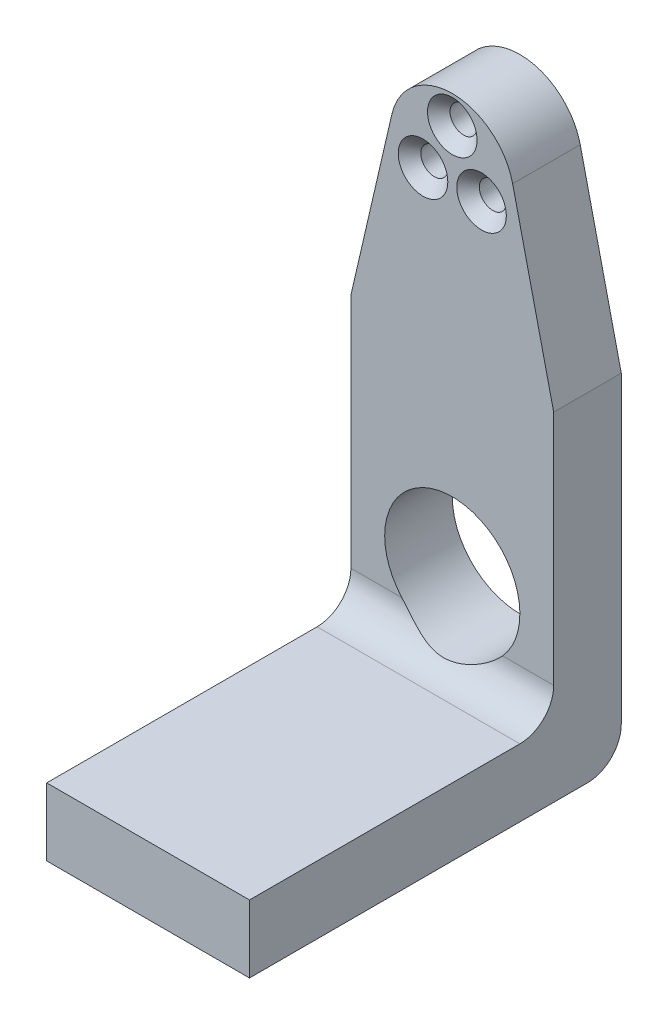
ISO-10303-21;
HEADER;
FILE_DESCRIPTION(('STEP AP214'),'2;1');
FILE_NAME('part.step','',(''),(''),'','','');
FILE_SCHEMA(('AUTOMOTIVE_DESIGN { 1 0 10303 214 1 1 1 1 }'));
ENDSEC;
DATA;
#1=APPLICATION_CONTEXT('core data for automotive mechanical design processes');
#2=APPLICATION_PROTOCOL_DEFINITION('international standard','automotive_design',2000,#1);
#3=PRODUCT_CONTEXT('',#1,'mechanical');
#4=PRODUCT('Part','Part','',(#3));
#5=PRODUCT_RELATED_PRODUCT_CATEGORY('part','',(#4));
#6=PRODUCT_DEFINITION_FORMATION('','',#4);
#7=PRODUCT_DEFINITION_CONTEXT('part definition',#1,'design');
#8=PRODUCT_DEFINITION('design','',#6,#7);
#9=PRODUCT_DEFINITION_SHAPE('','',#8);
#10=(LENGTH_UNIT() NAMED_UNIT(*) SI_UNIT(.MILLI.,.METRE.));
#11=(NAMED_UNIT(*) PLANE_ANGLE_UNIT() SI_UNIT($,.RADIAN.));
#12=(NAMED_UNIT(*) SI_UNIT($,.STERADIAN.) SOLID_ANGLE_UNIT());
#13=UNCERTAINTY_MEASURE_WITH_UNIT(LENGTH_MEASURE(1.E-05),#10,'distance_accuracy_value','');
#14=(GEOMETRIC_REPRESENTATION_CONTEXT(3) GLOBAL_UNCERTAINTY_ASSIGNED_CONTEXT((#13)) GLOBAL_UNIT_ASSIGNED_CONTEXT((#10,
#11,#12)) REPRESENTATION_CONTEXT('',''));
#15=CARTESIAN_POINT('',(0.,0.,0.));
#16=DIRECTION('',(0.,0.,1.));
#17=DIRECTION('',(1.,0.,0.));
#18=AXIS2_PLACEMENT_3D('',#15,#16,#17);
#19=CARTESIAN_POINT('',(0.,44.5,6.));
#20=DIRECTION('',(0.,0.,-1.));
#21=DIRECTION('',(-1.,0.,0.));
#22=AXIS2_PLACEMENT_3D('',#19,#20,#21);
#23=PLANE('',#22);
#24=CARTESIAN_POINT('',(2.59807621135334,43.,6.));
#25=DIRECTION('',(0.,0.,1.));
#26=DIRECTION('',(1.,0.,0.));
#27=AXIS2_PLACEMENT_3D('',#24,#25,#26);
#28=CIRCLE('',#27,2.2);
#29=CARTESIAN_POINT('',(4.79807621135334,43.,6.));
#30=VERTEX_POINT('',#29);
#31=EDGE_CURVE('E313',#30,#30,#28,.T.);
#32=ORIENTED_EDGE('',*,*,#31,.F.);
#33=EDGE_LOOP('',(#32));
#34=FACE_BOUND('',#33,.T.);
#35=CARTESIAN_POINT('',(-2.59807621135331,43.,6.));
#36=DIRECTION('',(0.,0.,1.));
#37=DIRECTION('',(1.,0.,0.));
#38=AXIS2_PLACEMENT_3D('',#35,#36,#37);
#39=CIRCLE('',#38,2.2);
#40=CARTESIAN_POINT('',(-0.398076211353314,43.,6.));
#41=VERTEX_POINT('',#40);
#42=EDGE_CURVE('E301',#41,#41,#39,.T.);
#43=ORIENTED_EDGE('',*,*,#42,.F.);
#44=EDGE_LOOP('',(#43));
#45=FACE_BOUND('',#44,.T.);
#46=CARTESIAN_POINT('',(0.,47.5,6.));
#47=DIRECTION('',(0.,0.,1.));
#48=DIRECTION('',(1.,0.,0.));
#49=AXIS2_PLACEMENT_3D('',#46,#47,#48);
#50=CIRCLE('',#49,2.2);
#51=CARTESIAN_POINT('',(2.2,47.5,6.));
#52=VERTEX_POINT('',#51);
#53=EDGE_CURVE('E289',#52,#52,#50,.T.);
#54=ORIENTED_EDGE('',*,*,#53,.F.);
#55=EDGE_LOOP('',(#54));
#56=FACE_BOUND('',#55,.T.);
#57=DIRECTION('',(-1.,0.,0.));
#58=VECTOR('',#57,1.);
#59=CARTESIAN_POINT('',(9.,9.,6.));
#60=LINE('',#59,#58);
#61=CARTESIAN_POINT('',(-9.,9.,6.));
#62=VERTEX_POINT('',#61);
#63=CARTESIAN_POINT('',(-4.47213595499958,9.,6.));
#64=VERTEX_POINT('',#63);
#65=EDGE_CURVE('E137',#62,#64,#60,.F.);
#66=ORIENTED_EDGE('',*,*,#65,.T.);
#67=CARTESIAN_POINT('',(0.,13.,6.));
#68=DIRECTION('',(0.,0.,-1.));
#69=DIRECTION('',(-1.,0.,0.));
#70=AXIS2_PLACEMENT_3D('',#67,#68,#69);
#71=CIRCLE('',#70,6.);
#72=CARTESIAN_POINT('',(4.47213595499958,9.,6.00000000000001));
#73=VERTEX_POINT('',#72);
#74=EDGE_CURVE('E61',#64,#73,#71,.T.);
#75=ORIENTED_EDGE('',*,*,#74,.T.);
#76=CARTESIAN_POINT('',(9.,9.,6.));
#77=VERTEX_POINT('',#76);
#78=EDGE_CURVE('E134',#73,#77,#60,.F.);
#79=ORIENTED_EDGE('',*,*,#78,.T.);
#80=DIRECTION('',(0.,1.,0.));
#81=VECTOR('',#80,1.);
#82=CARTESIAN_POINT('',(9.,0.,6.));
#83=LINE('',#82,#81);
#84=CARTESIAN_POINT('',(8.99999999999999,30.,6.));
#85=VERTEX_POINT('',#84);
#86=EDGE_CURVE('E179',#77,#85,#83,.T.);
#87=ORIENTED_EDGE('',*,*,#86,.T.);
#88=DIRECTION('',(-0.225405836197876,0.974264958318802,0.));
#89=VECTOR('',#88,1.);
#90=CARTESIAN_POINT('',(5.35845727075341,45.7397320990883,6.));
#91=LINE('',#90,#89);
#92=CARTESIAN_POINT('',(5.35845727075341,45.7397320990883,6.));
#93=VERTEX_POINT('',#92);
#94=EDGE_CURVE('E223',#85,#93,#91,.T.);
#95=ORIENTED_EDGE('',*,*,#94,.T.);
#96=CARTESIAN_POINT('',(0.,44.5,6.));
#97=DIRECTION('',(0.,0.,1.));
#98=DIRECTION('',(-1.,0.,0.));
#99=AXIS2_PLACEMENT_3D('',#96,#97,#98);
#100=CIRCLE('',#99,5.5);
#101=CARTESIAN_POINT('',(-5.35845727075341,45.7397320990883,6.));
#102=VERTEX_POINT('',#101);
#103=EDGE_CURVE('E202',#93,#102,#100,.T.);
#104=ORIENTED_EDGE('',*,*,#103,.T.);
#105=DIRECTION('',(-0.225405836197877,-0.974264958318802,0.));
#106=VECTOR('',#105,1.);
#107=CARTESIAN_POINT('',(-5.35845727075341,45.7397320990883,6.));
#108=LINE('',#107,#106);
#109=CARTESIAN_POINT('',(-9.,30.,6.));
#110=VERTEX_POINT('',#109);
#111=EDGE_CURVE('E194',#102,#110,#108,.T.);
#112=ORIENTED_EDGE('',*,*,#111,.T.);
#113=DIRECTION('',(0.,-1.,0.));
#114=VECTOR('',#113,1.);
#115=CARTESIAN_POINT('',(-9.,30.,6.));
#116=LINE('',#115,#114);
#117=EDGE_CURVE('E191',#110,#62,#116,.T.);
#118=ORIENTED_EDGE('',*,*,#117,.T.);
#119=EDGE_LOOP('',(#66,#75,#79,#87,#95,#104,#112,#118));
#120=FACE_BOUND('',#119,.T.);
#121=ADVANCED_FACE('F41',(#34,#45,#56,#120),#23,.F.);
#122=CARTESIAN_POINT('',(5.35845727075341,45.7397320990883,6.));
#123=DIRECTION('',(-0.974264958318802,-0.225405836197876,0.));
#124=DIRECTION('',(0.225405836197876,-0.974264958318802,0.));
#125=AXIS2_PLACEMENT_3D('',#122,#123,#124);
#126=PLANE('',#125);
#127=DIRECTION('',(-0.225405836197876,0.974264958318802,0.));
#128=VECTOR('',#127,1.);
#129=CARTESIAN_POINT('',(5.35845727075341,45.7397320990883,0.));
#130=LINE('',#129,#128);
#131=CARTESIAN_POINT('',(8.99999999999999,30.,0.));
#132=VERTEX_POINT('',#131);
#133=CARTESIAN_POINT('',(5.35845727075341,45.7397320990883,0.));
#134=VERTEX_POINT('',#133);
#135=EDGE_CURVE('E206',#132,#134,#130,.T.);
#136=ORIENTED_EDGE('',*,*,#135,.T.);
#137=DIRECTION('',(0.,0.,-1.));
#138=VECTOR('',#137,1.);
#139=CARTESIAN_POINT('',(5.35845727075341,45.7397320990883,6.));
#140=LINE('',#139,#138);
#141=EDGE_CURVE('E152',#93,#134,#140,.T.);
#142=ORIENTED_EDGE('',*,*,#141,.F.);
#143=ORIENTED_EDGE('',*,*,#94,.F.);
#144=DIRECTION('',(0.,0.,-1.));
#145=VECTOR('',#144,1.);
#146=CARTESIAN_POINT('',(8.99999999999999,30.,6.));
#147=LINE('',#146,#145);
#148=EDGE_CURVE('E200',#85,#132,#147,.T.);
#149=ORIENTED_EDGE('',*,*,#148,.T.);
#150=EDGE_LOOP('',(#136,#142,#143,#149));
#151=FACE_BOUND('',#150,.T.);
#152=ADVANCED_FACE('F250',(#151),#126,.F.);
#153=CARTESIAN_POINT('',(0.,44.5,6.));
#154=DIRECTION('',(0.,0.,-1.));
#155=DIRECTION('',(-1.,0.,0.));
#156=AXIS2_PLACEMENT_3D('',#153,#154,#155);
#157=CYLINDRICAL_SURFACE('',#156,5.5);
#158=CARTESIAN_POINT('',(0.,44.5,0.));
#159=DIRECTION('',(0.,0.,1.));
#160=DIRECTION('',(-1.,0.,0.));
#161=AXIS2_PLACEMENT_3D('',#158,#159,#160);
#162=CIRCLE('',#161,5.5);
#163=CARTESIAN_POINT('',(-5.35845727075341,45.7397320990883,0.));
#164=VERTEX_POINT('',#163);
#165=EDGE_CURVE('E210',#134,#164,#162,.T.);
#166=ORIENTED_EDGE('',*,*,#165,.T.);
#167=DIRECTION('',(0.,0.,-1.));
#168=VECTOR('',#167,1.);
#169=CARTESIAN_POINT('',(-5.35845727075341,45.7397320990883,6.));
#170=LINE('',#169,#168);
#171=EDGE_CURVE('E237',#102,#164,#170,.T.);
#172=ORIENTED_EDGE('',*,*,#171,.F.);
#173=ORIENTED_EDGE('',*,*,#103,.F.);
#174=ORIENTED_EDGE('',*,*,#141,.T.);
#175=EDGE_LOOP('',(#166,#172,#173,#174));
#176=FACE_BOUND('',#175,.T.);
#177=ADVANCED_FACE('F244',(#176),#157,.T.);
#178=CARTESIAN_POINT('',(-5.35845727075341,45.7397320990883,6.));
#179=DIRECTION('',(0.974264958318801,-0.225405836197877,0.));
#180=DIRECTION('',(0.225405836197877,0.974264958318801,0.));
#181=AXIS2_PLACEMENT_3D('',#178,#179,#180);
#182=PLANE('',#181);
#183=DIRECTION('',(-0.225405836197877,-0.974264958318802,0.));
#184=VECTOR('',#183,1.);
#185=CARTESIAN_POINT('',(-5.35845727075341,45.7397320990883,0.));
#186=LINE('',#185,#184);
#187=CARTESIAN_POINT('',(-9.,30.,0.));
#188=VERTEX_POINT('',#187);
#189=EDGE_CURVE('E214',#164,#188,#186,.T.);
#190=ORIENTED_EDGE('',*,*,#189,.T.);
#191=DIRECTION('',(0.,0.,-1.));
#192=VECTOR('',#191,1.);
#193=CARTESIAN_POINT('',(-9.,30.,6.));
#194=LINE('',#193,#192);
#195=EDGE_CURVE('E234',#110,#188,#194,.T.);
#196=ORIENTED_EDGE('',*,*,#195,.F.);
#197=ORIENTED_EDGE('',*,*,#111,.F.);
#198=ORIENTED_EDGE('',*,*,#171,.T.);
#199=EDGE_LOOP('',(#190,#196,#197,#198));
#200=FACE_BOUND('',#199,.T.);
#201=ADVANCED_FACE('F254',(#200),#182,.F.);
#202=CARTESIAN_POINT('',(-9.,30.,6.));
#203=DIRECTION('',(1.,0.,0.));
#204=DIRECTION('',(0.,1.,0.));
#205=AXIS2_PLACEMENT_3D('',#202,#203,#204);
#206=PLANE('',#205);
#207=DIRECTION('',(0.,-1.,0.));
#208=VECTOR('',#207,1.);
#209=CARTESIAN_POINT('',(-9.,30.,0.));
#210=LINE('',#209,#208);
#211=CARTESIAN_POINT('',(-9.,3.,0.));
#212=VERTEX_POINT('',#211);
#213=EDGE_CURVE('E217',#188,#212,#210,.T.);
#214=ORIENTED_EDGE('',*,*,#213,.T.);
#215=CARTESIAN_POINT('',(-9.,3.,3.));
#216=DIRECTION('',(1.,0.,0.));
#217=DIRECTION('',(0.,1.,0.));
#218=AXIS2_PLACEMENT_3D('',#215,#216,#217);
#219=CIRCLE('',#218,3.);
#220=CARTESIAN_POINT('',(-9.,0.,3.));
#221=VERTEX_POINT('',#220);
#222=EDGE_CURVE('E164',#212,#221,#219,.F.);
#223=ORIENTED_EDGE('',*,*,#222,.T.);
#224=DIRECTION('',(0.,0.,-1.));
#225=VECTOR('',#224,1.);
#226=CARTESIAN_POINT('',(-9.,0.,6.));
#227=LINE('',#226,#225);
#228=CARTESIAN_POINT('',(-9.,0.,33.));
#229=VERTEX_POINT('',#228);
#230=EDGE_CURVE('E230',#229,#221,#227,.T.);
#231=ORIENTED_EDGE('',*,*,#230,.F.);
#232=DIRECTION('',(0.,1.,0.));
#233=VECTOR('',#232,1.);
#234=CARTESIAN_POINT('',(-9.,0.,33.));
#235=LINE('',#234,#233);
#236=CARTESIAN_POINT('',(-9.,6.,33.));
#237=VERTEX_POINT('',#236);
#238=EDGE_CURVE('E211',#229,#237,#235,.T.);
#239=ORIENTED_EDGE('',*,*,#238,.T.);
#240=DIRECTION('',(0.,0.,-1.));
#241=VECTOR('',#240,1.);
#242=CARTESIAN_POINT('',(-9.,6.,84.9736659610103));
#243=LINE('',#242,#241);
#244=CARTESIAN_POINT('',(-9.,6.,9.00000000000001));
#245=VERTEX_POINT('',#244);
#246=EDGE_CURVE('E139',#237,#245,#243,.T.);
#247=ORIENTED_EDGE('',*,*,#246,.T.);
#248=CARTESIAN_POINT('',(-9.,9.,9.00000000000001));
#249=DIRECTION('',(1.,0.,0.));
#250=DIRECTION('',(0.,1.,0.));
#251=AXIS2_PLACEMENT_3D('',#248,#249,#250);
#252=CIRCLE('',#251,3.);
#253=EDGE_CURVE('E167',#245,#62,#252,.T.);
#254=ORIENTED_EDGE('',*,*,#253,.T.);
#255=ORIENTED_EDGE('',*,*,#117,.F.);
#256=ORIENTED_EDGE('',*,*,#195,.T.);
#257=EDGE_LOOP('',(#214,#223,#231,#239,#247,#254,#255,#256));
#258=FACE_BOUND('',#257,.T.);
#259=ADVANCED_FACE('F189',(#258),#206,.F.);
#260=CARTESIAN_POINT('',(-9.,0.,6.));
#261=DIRECTION('',(0.,1.,0.));
#262=DIRECTION('',(-1.,0.,0.));
#263=AXIS2_PLACEMENT_3D('',#260,#261,#262);
#264=PLANE('',#263);
#265=ORIENTED_EDGE('',*,*,#230,.T.);
#266=DIRECTION('',(1.,0.,0.));
#267=VECTOR('',#266,1.);
#268=CARTESIAN_POINT('',(9.,0.,3.));
#269=LINE('',#268,#267);
#270=CARTESIAN_POINT('',(9.,0.,3.));
#271=VERTEX_POINT('',#270);
#272=EDGE_CURVE('E150',#221,#271,#269,.T.);
#273=ORIENTED_EDGE('',*,*,#272,.T.);
#274=DIRECTION('',(0.,0.,-1.));
#275=VECTOR('',#274,1.);
#276=CARTESIAN_POINT('',(9.,0.,6.));
#277=LINE('',#276,#275);
#278=CARTESIAN_POINT('',(9.,0.,33.));
#279=VERTEX_POINT('',#278);
#280=EDGE_CURVE('E227',#279,#271,#277,.T.);
#281=ORIENTED_EDGE('',*,*,#280,.F.);
#282=DIRECTION('',(-1.,0.,0.));
#283=VECTOR('',#282,1.);
#284=CARTESIAN_POINT('',(-9.,0.,33.));
#285=LINE('',#284,#283);
#286=EDGE_CURVE('E265',#279,#229,#285,.T.);
#287=ORIENTED_EDGE('',*,*,#286,.T.);
#288=EDGE_LOOP('',(#265,#273,#281,#287));
#289=FACE_BOUND('',#288,.T.);
#290=ADVANCED_FACE('F259',(#289),#264,.F.);
#291=CARTESIAN_POINT('',(9.,0.,6.));
#292=DIRECTION('',(-1.,0.,0.));
#293=DIRECTION('',(0.,-1.,0.));
#294=AXIS2_PLACEMENT_3D('',#291,#292,#293);
#295=PLANE('',#294);
#296=ORIENTED_EDGE('',*,*,#280,.T.);
#297=CARTESIAN_POINT('',(9.,3.,3.));
#298=DIRECTION('',(-1.,0.,0.));
#299=DIRECTION('',(0.,-1.,0.));
#300=AXIS2_PLACEMENT_3D('',#297,#298,#299);
#301=CIRCLE('',#300,3.);
#302=CARTESIAN_POINT('',(9.,3.,0.));
#303=VERTEX_POINT('',#302);
#304=EDGE_CURVE('E159',#271,#303,#301,.F.);
#305=ORIENTED_EDGE('',*,*,#304,.T.);
#306=DIRECTION('',(0.,1.,0.));
#307=VECTOR('',#306,1.);
#308=CARTESIAN_POINT('',(9.,0.,0.));
#309=LINE('',#308,#307);
#310=EDGE_CURVE('E220',#303,#132,#309,.T.);
#311=ORIENTED_EDGE('',*,*,#310,.T.);
#312=ORIENTED_EDGE('',*,*,#148,.F.);
#313=ORIENTED_EDGE('',*,*,#86,.F.);
#314=CARTESIAN_POINT('',(9.,9.,9.00000000000001));
#315=DIRECTION('',(-1.,0.,0.));
#316=DIRECTION('',(0.,-1.,0.));
#317=AXIS2_PLACEMENT_3D('',#314,#315,#316);
#318=CIRCLE('',#317,3.);
#319=CARTESIAN_POINT('',(9.,6.,9.00000000000001));
#320=VERTEX_POINT('',#319);
#321=EDGE_CURVE('E55',#77,#320,#318,.T.);
#322=ORIENTED_EDGE('',*,*,#321,.T.);
#323=DIRECTION('',(0.,0.,-1.));
#324=VECTOR('',#323,1.);
#325=CARTESIAN_POINT('',(9.,6.,84.9736659610103));
#326=LINE('',#325,#324);
#327=CARTESIAN_POINT('',(9.,6.,33.));
#328=VERTEX_POINT('',#327);
#329=EDGE_CURVE('E176',#328,#320,#326,.T.);
#330=ORIENTED_EDGE('',*,*,#329,.F.);
#331=DIRECTION('',(0.,-1.,0.));
#332=VECTOR('',#331,1.);
#333=CARTESIAN_POINT('',(9.,0.,33.));
#334=LINE('',#333,#332);
#335=EDGE_CURVE('E262',#328,#279,#334,.T.);
#336=ORIENTED_EDGE('',*,*,#335,.T.);
#337=EDGE_LOOP('',(#296,#305,#311,#312,#313,#322,#330,#336));
#338=FACE_BOUND('',#337,.T.);
#339=ADVANCED_FACE('F174',(#338),#295,.F.);
#340=CARTESIAN_POINT('',(0.,44.5,0.));
#341=DIRECTION('',(0.,0.,-1.));
#342=DIRECTION('',(-1.,0.,0.));
#343=AXIS2_PLACEMENT_3D('',#340,#341,#342);
#344=PLANE('',#343);
#345=CARTESIAN_POINT('',(2.59807621135334,43.,0.));
#346=DIRECTION('',(0.,0.,1.));
#347=DIRECTION('',(1.,0.,0.));
#348=AXIS2_PLACEMENT_3D('',#345,#346,#347);
#349=CIRCLE('',#348,1.2);
#350=CARTESIAN_POINT('',(3.79807621135333,43.,0.));
#351=VERTEX_POINT('',#350);
#352=EDGE_CURVE('E305',#351,#351,#349,.T.);
#353=ORIENTED_EDGE('',*,*,#352,.T.);
#354=EDGE_LOOP('',(#353));
#355=FACE_BOUND('',#354,.T.);
#356=CARTESIAN_POINT('',(-2.59807621135331,43.,0.));
#357=DIRECTION('',(0.,0.,1.));
#358=DIRECTION('',(1.,0.,0.));
#359=AXIS2_PLACEMENT_3D('',#356,#357,#358);
#360=CIRCLE('',#359,1.2);
#361=CARTESIAN_POINT('',(-1.39807621135331,43.,0.));
#362=VERTEX_POINT('',#361);
#363=EDGE_CURVE('E293',#362,#362,#360,.T.);
#364=ORIENTED_EDGE('',*,*,#363,.T.);
#365=EDGE_LOOP('',(#364));
#366=FACE_BOUND('',#365,.T.);
#367=CARTESIAN_POINT('',(0.,47.5,0.));
#368=DIRECTION('',(0.,0.,1.));
#369=DIRECTION('',(1.,0.,0.));
#370=AXIS2_PLACEMENT_3D('',#367,#368,#369);
#371=CIRCLE('',#370,1.2);
#372=CARTESIAN_POINT('',(1.2,47.5,0.));
#373=VERTEX_POINT('',#372);
#374=EDGE_CURVE('E282',#373,#373,#371,.T.);
#375=ORIENTED_EDGE('',*,*,#374,.T.);
#376=EDGE_LOOP('',(#375));
#377=FACE_BOUND('',#376,.T.);
#378=CARTESIAN_POINT('',(0.,13.,0.));
#379=DIRECTION('',(0.,0.,-1.));
#380=DIRECTION('',(-1.,0.,0.));
#381=AXIS2_PLACEMENT_3D('',#378,#379,#380);
#382=CIRCLE('',#381,6.);
#383=CARTESIAN_POINT('',(-6.,13.,0.));
#384=VERTEX_POINT('',#383);
#385=EDGE_CURVE('E140',#384,#384,#382,.T.);
#386=ORIENTED_EDGE('',*,*,#385,.F.);
#387=EDGE_LOOP('',(#386));
#388=FACE_BOUND('',#387,.T.);
#389=ORIENTED_EDGE('',*,*,#310,.F.);
#390=DIRECTION('',(1.,0.,0.));
#391=VECTOR('',#390,1.);
#392=CARTESIAN_POINT('',(-9.,3.,0.));
#393=LINE('',#392,#391);
#394=EDGE_CURVE('E68',#303,#212,#393,.F.);
#395=ORIENTED_EDGE('',*,*,#394,.T.);
#396=ORIENTED_EDGE('',*,*,#213,.F.);
#397=ORIENTED_EDGE('',*,*,#189,.F.);
#398=ORIENTED_EDGE('',*,*,#165,.F.);
#399=ORIENTED_EDGE('',*,*,#135,.F.);
#400=EDGE_LOOP('',(#389,#395,#396,#397,#398,#399));
#401=FACE_BOUND('',#400,.T.);
#402=ADVANCED_FACE('F251',(#355,#366,#377,#388,#401),#344,.T.);
#403=CARTESIAN_POINT('',(-9.,6.,84.9736659610103));
#404=DIRECTION('',(0.,-1.,0.));
#405=DIRECTION('',(0.,0.,-1.));
#406=AXIS2_PLACEMENT_3D('',#403,#404,#405);
#407=PLANE('',#406);
#408=ORIENTED_EDGE('',*,*,#329,.T.);
#409=DIRECTION('',(-1.,0.,0.));
#410=VECTOR('',#409,1.);
#411=CARTESIAN_POINT('',(-9.,6.,9.00000000000001));
#412=LINE('',#411,#410);
#413=EDGE_CURVE('E146',#320,#245,#412,.T.);
#414=ORIENTED_EDGE('',*,*,#413,.T.);
#415=ORIENTED_EDGE('',*,*,#246,.F.);
#416=DIRECTION('',(1.,0.,0.));
#417=VECTOR('',#416,1.);
#418=CARTESIAN_POINT('',(-9.,6.,33.));
#419=LINE('',#418,#417);
#420=EDGE_CURVE('E184',#237,#328,#419,.T.);
#421=ORIENTED_EDGE('',*,*,#420,.T.);
#422=EDGE_LOOP('',(#408,#414,#415,#421));
#423=FACE_BOUND('',#422,.T.);
#424=ADVANCED_FACE('F181',(#423),#407,.F.);
#425=CARTESIAN_POINT('',(0.,44.5,33.));
#426=DIRECTION('',(0.,0.,-1.));
#427=DIRECTION('',(-1.,0.,0.));
#428=AXIS2_PLACEMENT_3D('',#425,#426,#427);
#429=PLANE('',#428);
#430=ORIENTED_EDGE('',*,*,#286,.F.);
#431=ORIENTED_EDGE('',*,*,#335,.F.);
#432=ORIENTED_EDGE('',*,*,#420,.F.);
#433=ORIENTED_EDGE('',*,*,#238,.F.);
#434=EDGE_LOOP('',(#430,#431,#432,#433));
#435=FACE_BOUND('',#434,.T.);
#436=ADVANCED_FACE('F349',(#435),#429,.F.);
#437=CARTESIAN_POINT('',(-9.,9.,9.00000000000001));
#438=DIRECTION('',(1.,0.,0.));
#439=DIRECTION('',(0.,0.,-1.));
#440=AXIS2_PLACEMENT_3D('',#437,#438,#439);
#441=CYLINDRICAL_SURFACE('',#440,3.);
#442=ORIENTED_EDGE('',*,*,#78,.F.);
#443=CARTESIAN_POINT('',(4.47213595499958,9.,6.00000000000001));
#444=CARTESIAN_POINT('',(4.38693474391535,8.90471365181576,6.00001150169716));
#445=CARTESIAN_POINT('',(4.29873220996522,8.81225404281387,6.00453688798032));
#446=CARTESIAN_POINT('',(4.11712768862441,8.63360646625974,6.02110712918036));
#447=CARTESIAN_POINT('',(4.02373480436576,8.54740809420755,6.03313917537773));
#448=CARTESIAN_POINT('',(3.83270619347735,8.38196155459082,6.06315429260364));
#449=CARTESIAN_POINT('',(3.73509235584113,8.30268276367389,6.08110926475485));
#450=CARTESIAN_POINT('',(3.53566092620661,8.15079186243183,6.12162765054473));
#451=CARTESIAN_POINT('',(3.4338410299131,8.07818347864384,6.1441936177709));
#452=CARTESIAN_POINT('',(3.18763745416332,7.91390974560992,6.20168740623355));
#453=CARTESIAN_POINT('',(3.0415727125242,7.82526867857052,6.2380827106836));
#454=CARTESIAN_POINT('',(2.74302548046996,7.66100582783213,6.31387322317415));
#455=CARTESIAN_POINT('',(2.59054105622536,7.58538800261173,6.3532693380963));
#456=CARTESIAN_POINT('',(2.27930411751881,7.44717801597278,6.4319118170127));
#457=CARTESIAN_POINT('',(2.12053821007044,7.38461569299406,6.47115764100163));
#458=CARTESIAN_POINT('',(1.79750608859763,7.27303318887318,6.54600290705371));
#459=CARTESIAN_POINT('',(1.63324194985381,7.22400796142787,6.58160370477249));
#460=CARTESIAN_POINT('',(1.33863121667168,7.14974697916958,6.63817695504575));
#461=CARTESIAN_POINT('',(1.20929276985795,7.12162995969205,6.66062539252567));
#462=CARTESIAN_POINT('',(0.948205740640195,7.07391324706374,6.69975085996912));
#463=CARTESIAN_POINT('',(0.816457909241211,7.05431094548803,6.7164296571028));
#464=CARTESIAN_POINT('',(0.551730609098209,7.02394167999927,6.74265661310367));
#465=CARTESIAN_POINT('',(0.418757597400548,7.01314191521176,6.75223123217752));
#466=CARTESIAN_POINT('',(0.152047842708511,7.00044155816295,6.76352041652827));
#467=CARTESIAN_POINT('',(0.0183111229519621,6.9985406965585,6.76523521969825));
#468=CARTESIAN_POINT('',(-0.24896761557005,7.00367627495911,6.760646894596));
#469=CARTESIAN_POINT('',(-0.38250935494746,7.01072067420721,6.7543366258316));
#470=CARTESIAN_POINT('',(-0.648257713381703,7.03363131944154,6.73425019519349));
#471=CARTESIAN_POINT('',(-0.78046424821222,7.04949811845991,6.72047356529229));
#472=CARTESIAN_POINT('',(-1.04326736656081,7.08989467385797,6.68651958104542));
#473=CARTESIAN_POINT('',(-1.17385492579168,7.11446031616621,6.66631574775277));
#474=CARTESIAN_POINT('',(-1.43231796581765,7.17196367705255,6.62100420320369));
#475=CARTESIAN_POINT('',(-1.56019259223582,7.2049039918543,6.59589497178984));
#476=CARTESIAN_POINT('',(-1.85160257970742,7.29025885920174,6.53416565770466));
#477=CARTESIAN_POINT('',(-2.01405637343104,7.3455477992725,6.49637620349935));
#478=CARTESIAN_POINT('',(-2.33317713057882,7.46957129400837,6.41869177888945));
#479=CARTESIAN_POINT('',(-2.48984185871251,7.5383109791327,6.37879600933533));
#480=CARTESIAN_POINT('',(-2.94952342908649,7.76393257577933,6.2612417578869));
#481=CARTESIAN_POINT('',(-3.2437628636355,7.94066870803203,6.18532995578135));
#482=CARTESIAN_POINT('',(-3.69367010193987,8.26699322879898,6.08804918352555));
#483=CARTESIAN_POINT('',(-3.85889139379084,8.40061108505724,6.0569416457783));
#484=CARTESIAN_POINT('',(-4.09672142744903,8.61498728036572,6.02392576149051));
#485=CARTESIAN_POINT('',(-4.17450409345807,8.68896358819514,6.01519031119011));
#486=CARTESIAN_POINT('',(-4.32628428103204,8.84129042428804,6.00322639409502));
#487=CARTESIAN_POINT('',(-4.40027717731426,8.91964606454824,6.00000450803477));
#488=CARTESIAN_POINT('',(-4.47213595499958,9.,6.00000000000001));
#489=B_SPLINE_CURVE_WITH_KNOTS('',3,(#443,#444,#445,#446,#447,#448,#449,#450,#451,#452,#453,
#454,#455,#456,#457,#458,#459,#460,#461,#462,#463,#464,#465,#466,#467,#468,#469,#470,#471,#472,
#473,#474,#475,#476,#477,#478,#479,#480,#481,#482,#483,#484,#485,#486,#487,#488),.UNSPECIFIED.,
.F.,.F.,(4,2,2,2,2,2,2,2,2,2,2,2,2,2,2,2,2,2,2,2,2,2,4),(0.,0.38317106197228,0.765690095213907,
1.14641991400536,1.52736115675284,2.05072488899296,2.57424742053795,3.0989536696793,
3.62346405609251,4.02584724528558,4.42810708008792,4.82886103248957,5.22960285519029,
5.63070149673649,6.03182528398687,6.43462351146919,6.83754676260618,7.36395422366977,
7.89056286280961,8.9388959465241,9.58145610417012,9.90427531068803,10.2274795511922),.UNSPECIFIED.);
#490=EDGE_CURVE('E12',#73,#64,#489,.T.);
#491=ORIENTED_EDGE('',*,*,#490,.T.);
#492=ORIENTED_EDGE('',*,*,#65,.F.);
#493=ORIENTED_EDGE('',*,*,#253,.F.);
#494=ORIENTED_EDGE('',*,*,#413,.F.);
#495=ORIENTED_EDGE('',*,*,#321,.F.);
#496=EDGE_LOOP('',(#442,#491,#492,#493,#494,#495));
#497=FACE_BOUND('',#496,.T.);
#498=ADVANCED_FACE('F143',(#497),#441,.F.);
#499=CARTESIAN_POINT('',(-9.,3.,3.));
#500=DIRECTION('',(-1.,0.,0.));
#501=DIRECTION('',(0.,-1.,0.));
#502=AXIS2_PLACEMENT_3D('',#499,#500,#501);
#503=CYLINDRICAL_SURFACE('',#502,3.);
#504=ORIENTED_EDGE('',*,*,#222,.F.);
#505=ORIENTED_EDGE('',*,*,#394,.F.);
#506=ORIENTED_EDGE('',*,*,#304,.F.);
#507=ORIENTED_EDGE('',*,*,#272,.F.);
#508=EDGE_LOOP('',(#504,#505,#506,#507));
#509=FACE_BOUND('',#508,.T.);
#510=ADVANCED_FACE('F43',(#509),#503,.T.);
#511=CARTESIAN_POINT('',(0.,13.,33.));
#512=DIRECTION('',(0.,0.,-1.));
#513=DIRECTION('',(-1.,0.,0.));
#514=AXIS2_PLACEMENT_3D('',#511,#512,#513);
#515=CYLINDRICAL_SURFACE('',#514,6.);
#516=ORIENTED_EDGE('',*,*,#385,.T.);
#517=EDGE_LOOP('',(#516));
#518=FACE_BOUND('',#517,.T.);
#519=ORIENTED_EDGE('',*,*,#490,.F.);
#520=ORIENTED_EDGE('',*,*,#74,.F.);
#521=EDGE_LOOP('',(#519,#520));
#522=FACE_BOUND('',#521,.T.);
#523=ADVANCED_FACE('F128',(#518,#522),#515,.F.);
#524=CARTESIAN_POINT('',(0.,47.5,6.));
#525=DIRECTION('',(0.,0.,1.));
#526=DIRECTION('',(1.,0.,0.));
#527=AXIS2_PLACEMENT_3D('',#524,#525,#526);
#528=CYLINDRICAL_SURFACE('',#527,1.19999999999999);
#529=ORIENTED_EDGE('',*,*,#374,.F.);
#530=EDGE_LOOP('',(#529));
#531=FACE_BOUND('',#530,.T.);
#532=CARTESIAN_POINT('',(0.,47.5,5.));
#533=DIRECTION('',(0.,0.,1.));
#534=DIRECTION('',(1.,0.,0.));
#535=AXIS2_PLACEMENT_3D('',#532,#533,#534);
#536=CIRCLE('',#535,1.19999999999999);
#537=CARTESIAN_POINT('',(1.19999999999999,47.5,5.));
#538=VERTEX_POINT('',#537);
#539=EDGE_CURVE('E285',#538,#538,#536,.T.);
#540=ORIENTED_EDGE('',*,*,#539,.T.);
#541=EDGE_LOOP('',(#540));
#542=FACE_BOUND('',#541,.T.);
#543=ADVANCED_FACE('F331',(#531,#542),#528,.F.);
#544=CARTESIAN_POINT('',(0.,47.5,6.));
#545=DIRECTION('',(0.,0.,1.));
#546=DIRECTION('',(1.,0.,0.));
#547=AXIS2_PLACEMENT_3D('',#544,#545,#546);
#548=CONICAL_SURFACE('',#547,2.2,0.785398163397453);
#549=ORIENTED_EDGE('',*,*,#539,.F.);
#550=EDGE_LOOP('',(#549));
#551=FACE_BOUND('',#550,.T.);
#552=ORIENTED_EDGE('',*,*,#53,.T.);
#553=EDGE_LOOP('',(#552));
#554=FACE_BOUND('',#553,.T.);
#555=ADVANCED_FACE('F328',(#551,#554),#548,.F.);
#556=CARTESIAN_POINT('',(-2.59807621135331,43.,6.));
#557=DIRECTION('',(0.,0.,1.));
#558=DIRECTION('',(1.,0.,0.));
#559=AXIS2_PLACEMENT_3D('',#556,#557,#558);
#560=CYLINDRICAL_SURFACE('',#559,1.19999999999999);
#561=ORIENTED_EDGE('',*,*,#363,.F.);
#562=EDGE_LOOP('',(#561));
#563=FACE_BOUND('',#562,.T.);
#564=CARTESIAN_POINT('',(-2.59807621135331,43.,5.));
#565=DIRECTION('',(0.,0.,1.));
#566=DIRECTION('',(1.,0.,0.));
#567=AXIS2_PLACEMENT_3D('',#564,#565,#566);
#568=CIRCLE('',#567,1.19999999999999);
#569=CARTESIAN_POINT('',(-1.39807621135333,43.,5.));
#570=VERTEX_POINT('',#569);
#571=EDGE_CURVE('E297',#570,#570,#568,.T.);
#572=ORIENTED_EDGE('',*,*,#571,.T.);
#573=EDGE_LOOP('',(#572));
#574=FACE_BOUND('',#573,.T.);
#575=ADVANCED_FACE('F330',(#563,#574),#560,.F.);
#576=CARTESIAN_POINT('',(-2.59807621135331,43.,6.));
#577=DIRECTION('',(0.,0.,1.));
#578=DIRECTION('',(1.,0.,0.));
#579=AXIS2_PLACEMENT_3D('',#576,#577,#578);
#580=CONICAL_SURFACE('',#579,2.2,0.785398163397453);
#581=ORIENTED_EDGE('',*,*,#571,.F.);
#582=EDGE_LOOP('',(#581));
#583=FACE_BOUND('',#582,.T.);
#584=ORIENTED_EDGE('',*,*,#42,.T.);
#585=EDGE_LOOP('',(#584));
#586=FACE_BOUND('',#585,.T.);
#587=ADVANCED_FACE('F338',(#583,#586),#580,.F.);
#588=CARTESIAN_POINT('',(2.59807621135334,43.,6.));
#589=DIRECTION('',(0.,0.,1.));
#590=DIRECTION('',(1.,0.,0.));
#591=AXIS2_PLACEMENT_3D('',#588,#589,#590);
#592=CYLINDRICAL_SURFACE('',#591,1.19999999999999);
#593=ORIENTED_EDGE('',*,*,#352,.F.);
#594=EDGE_LOOP('',(#593));
#595=FACE_BOUND('',#594,.T.);
#596=CARTESIAN_POINT('',(2.59807621135334,43.,5.));
#597=DIRECTION('',(0.,0.,1.));
#598=DIRECTION('',(1.,0.,0.));
#599=AXIS2_PLACEMENT_3D('',#596,#597,#598);
#600=CIRCLE('',#599,1.19999999999999);
#601=CARTESIAN_POINT('',(3.79807621135332,43.,5.));
#602=VERTEX_POINT('',#601);
#603=EDGE_CURVE('E309',#602,#602,#600,.T.);
#604=ORIENTED_EDGE('',*,*,#603,.T.);
#605=EDGE_LOOP('',(#604));
#606=FACE_BOUND('',#605,.T.);
#607=ADVANCED_FACE('F417',(#595,#606),#592,.F.);
#608=CARTESIAN_POINT('',(2.59807621135334,43.,6.));
#609=DIRECTION('',(0.,0.,1.));
#610=DIRECTION('',(1.,0.,0.));
#611=AXIS2_PLACEMENT_3D('',#608,#609,#610);
#612=CONICAL_SURFACE('',#611,2.2,0.785398163397453);
#613=ORIENTED_EDGE('',*,*,#603,.F.);
#614=EDGE_LOOP('',(#613));
#615=FACE_BOUND('',#614,.T.);
#616=ORIENTED_EDGE('',*,*,#31,.T.);
#617=EDGE_LOOP('',(#616));
#618=FACE_BOUND('',#617,.T.);
#619=ADVANCED_FACE('F319',(#615,#618),#612,.F.);
#620=CLOSED_SHELL('',(#121,#152,#177,#201,#259,#290,#339,#402,#424,#436,#498,#510,#523,#543,
#555,#575,#587,#607,#619));
#621=MANIFOLD_SOLID_BREP('B2',#620);
#622=ADVANCED_BREP_SHAPE_REPRESENTATION('',(#18,#621),#14);
#623=SHAPE_DEFINITION_REPRESENTATION(#9,#622);
ENDSEC;
END-ISO-10303-21;
